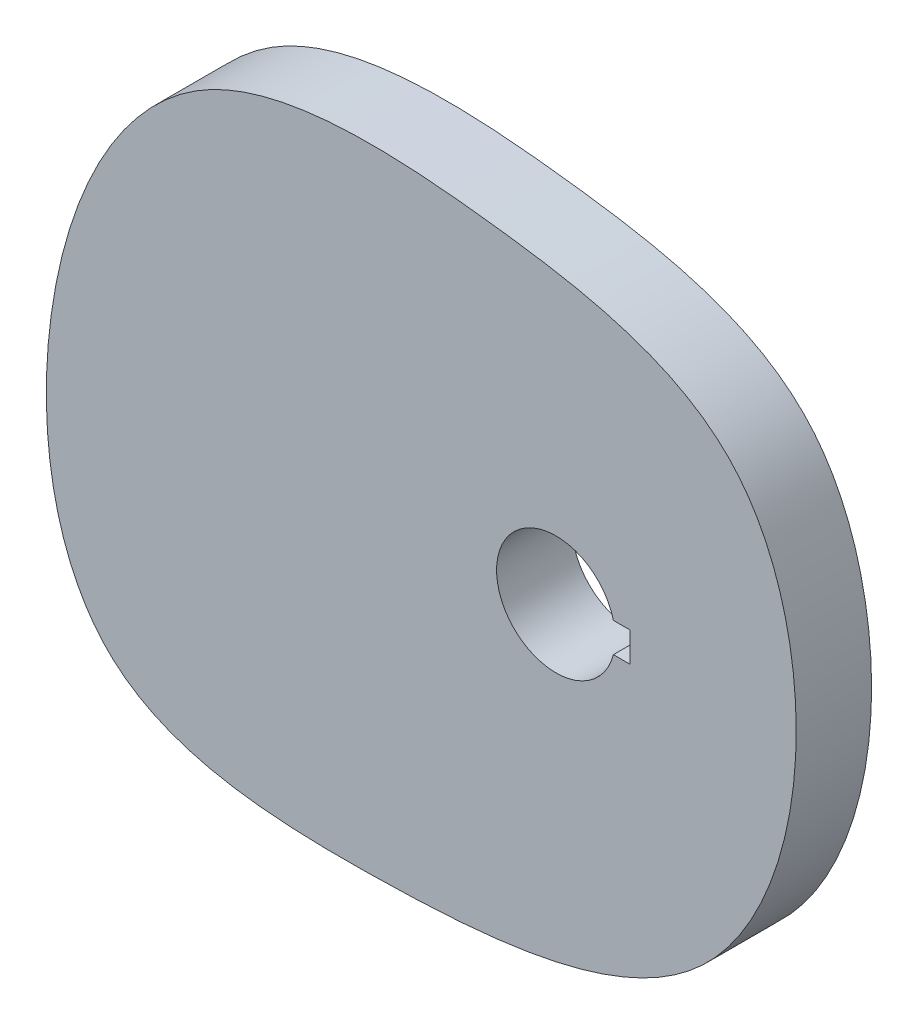
ISO-10303-21;
HEADER;
FILE_DESCRIPTION(('STEP AP214'),'2;1');
FILE_NAME('part.step','',(''),(''),'','','');
FILE_SCHEMA(('AUTOMOTIVE_DESIGN { 1 0 10303 214 1 1 1 1 }'));
ENDSEC;
DATA;
#1=APPLICATION_CONTEXT('core data for automotive mechanical design processes');
#2=APPLICATION_PROTOCOL_DEFINITION('international standard','automotive_design',2000,#1);
#3=PRODUCT_CONTEXT('',#1,'mechanical');
#4=PRODUCT('Part','Part','',(#3));
#5=PRODUCT_RELATED_PRODUCT_CATEGORY('part','',(#4));
#6=PRODUCT_DEFINITION_FORMATION('','',#4);
#7=PRODUCT_DEFINITION_CONTEXT('part definition',#1,'design');
#8=PRODUCT_DEFINITION('design','',#6,#7);
#9=PRODUCT_DEFINITION_SHAPE('','',#8);
#10=(LENGTH_UNIT() NAMED_UNIT(*) SI_UNIT(.MILLI.,.METRE.));
#11=(NAMED_UNIT(*) PLANE_ANGLE_UNIT() SI_UNIT($,.RADIAN.));
#12=(NAMED_UNIT(*) SI_UNIT($,.STERADIAN.) SOLID_ANGLE_UNIT());
#13=UNCERTAINTY_MEASURE_WITH_UNIT(LENGTH_MEASURE(1.E-05),#10,'distance_accuracy_value','');
#14=(GEOMETRIC_REPRESENTATION_CONTEXT(3) GLOBAL_UNCERTAINTY_ASSIGNED_CONTEXT((#13)) GLOBAL_UNIT_ASSIGNED_CONTEXT((#10,
#11,#12)) REPRESENTATION_CONTEXT('',''));
#15=CARTESIAN_POINT('',(0.,0.,0.));
#16=DIRECTION('',(0.,0.,1.));
#17=DIRECTION('',(1.,0.,0.));
#18=AXIS2_PLACEMENT_3D('',#15,#16,#17);
#19=CARTESIAN_POINT('',(-171.443441205203,-33.535808517405,12.7));
#20=DIRECTION('',(0.,0.,-1.));
#21=DIRECTION('',(-1.,0.,0.));
#22=AXIS2_PLACEMENT_3D('',#19,#20,#21);
#23=PLANE('',#22);
#24=CARTESIAN_POINT('',(80.,20.,12.7));
#25=CARTESIAN_POINT('',(77.7152862958963,39.0890435782655,12.7));
#26=CARTESIAN_POINT('',(61.3816559562024,86.2907134094538,12.7));
#27=CARTESIAN_POINT('',(-25.312200484567,103.207072369044,12.7));
#28=CARTESIAN_POINT('',(-130.731631299428,107.805639115145,12.7));
#29=CARTESIAN_POINT('',(-180.04363028462,6.70139491009228,12.7));
#30=CARTESIAN_POINT('',(-165.342731179708,-107.547641326452,12.7));
#31=CARTESIAN_POINT('',(-50.756482262121,-112.60193231846,12.7));
#32=CARTESIAN_POINT('',(62.0064198469547,-101.040992338703,12.7));
#33=CARTESIAN_POINT('',(84.4294115798182,-17.0082389409897,12.7));
#34=CARTESIAN_POINT('',(80.,20.,12.7));
#35=B_SPLINE_CURVE_WITH_KNOTS('',3,(#24,#25,#26,#27,#28,#29,#30,#31,#32,#33,#34),.UNSPECIFIED.,
.T.,.F.,(4,1,1,1,1,1,1,1,4),(0.,0.0722299683513067,0.186828711791828,0.321625365941841,
0.459718268549952,0.583377883104641,0.70703749765933,0.859966586776048,1.),.UNSPECIFIED.);
#36=CARTESIAN_POINT('',(80.,20.,12.7));
#37=VERTEX_POINT('',#36);
#38=EDGE_CURVE('E11',#37,#37,#35,.T.);
#39=ORIENTED_EDGE('',*,*,#38,.T.);
#40=EDGE_LOOP('',(#39));
#41=FACE_BOUND('',#40,.T.);
#42=DIRECTION('',(0.,1.,0.));
#43=VECTOR('',#42,1.);
#44=CARTESIAN_POINT('',(25.,5.,12.7));
#45=LINE('',#44,#43);
#46=CARTESIAN_POINT('',(25.,-5.,12.7));
#47=VERTEX_POINT('',#46);
#48=CARTESIAN_POINT('',(25.,5.,12.7));
#49=VERTEX_POINT('',#48);
#50=EDGE_CURVE('E95',#47,#49,#45,.T.);
#51=ORIENTED_EDGE('',*,*,#50,.F.);
#52=DIRECTION('',(1.,0.,0.));
#53=VECTOR('',#52,1.);
#54=CARTESIAN_POINT('',(19.3649167310371,-5.,12.7));
#55=LINE('',#54,#53);
#56=CARTESIAN_POINT('',(19.3649167310371,-5.,12.7));
#57=VERTEX_POINT('',#56);
#58=EDGE_CURVE('E109',#57,#47,#55,.T.);
#59=ORIENTED_EDGE('',*,*,#58,.F.);
#60=CARTESIAN_POINT('',(0.,0.,12.7));
#61=DIRECTION('',(0.,0.,1.));
#62=DIRECTION('',(1.,0.,0.));
#63=AXIS2_PLACEMENT_3D('',#60,#61,#62);
#64=CIRCLE('',#63,20.);
#65=CARTESIAN_POINT('',(19.3649167310371,5.,12.7));
#66=VERTEX_POINT('',#65);
#67=EDGE_CURVE('E107',#66,#57,#64,.T.);
#68=ORIENTED_EDGE('',*,*,#67,.F.);
#69=DIRECTION('',(-1.,0.,0.));
#70=VECTOR('',#69,1.);
#71=CARTESIAN_POINT('',(19.3649167310371,5.,12.7));
#72=LINE('',#71,#70);
#73=EDGE_CURVE('E105',#49,#66,#72,.T.);
#74=ORIENTED_EDGE('',*,*,#73,.F.);
#75=EDGE_LOOP('',(#51,#59,#68,#74));
#76=FACE_BOUND('',#75,.T.);
#77=ADVANCED_FACE('F36',(#41,#76),#23,.F.);
#78=CARTESIAN_POINT('',(-171.443441205203,-33.535808517405,-12.7));
#79=DIRECTION('',(0.,0.,-1.));
#80=DIRECTION('',(-1.,0.,0.));
#81=AXIS2_PLACEMENT_3D('',#78,#79,#80);
#82=PLANE('',#81);
#83=CARTESIAN_POINT('',(80.,20.,-12.7));
#84=CARTESIAN_POINT('',(77.7152862958963,39.0890435782655,-12.7));
#85=CARTESIAN_POINT('',(61.3816559562024,86.2907134094538,-12.7));
#86=CARTESIAN_POINT('',(-25.312200484567,103.207072369044,-12.7));
#87=CARTESIAN_POINT('',(-130.731631299428,107.805639115145,-12.7));
#88=CARTESIAN_POINT('',(-180.04363028462,6.70139491009228,-12.7));
#89=CARTESIAN_POINT('',(-165.342731179708,-107.547641326452,-12.7));
#90=CARTESIAN_POINT('',(-50.756482262121,-112.60193231846,-12.7));
#91=CARTESIAN_POINT('',(62.0064198469547,-101.040992338703,-12.7));
#92=CARTESIAN_POINT('',(84.4294115798182,-17.0082389409897,-12.7));
#93=CARTESIAN_POINT('',(80.,20.,-12.7));
#94=B_SPLINE_CURVE_WITH_KNOTS('',3,(#83,#84,#85,#86,#87,#88,#89,#90,#91,#92,#93),.UNSPECIFIED.,
.T.,.F.,(4,1,1,1,1,1,1,1,4),(0.,0.0722299683513067,0.186828711791828,0.321625365941841,
0.459718268549952,0.583377883104641,0.70703749765933,0.859966586776048,1.),.UNSPECIFIED.);
#95=CARTESIAN_POINT('',(80.,20.,-12.7));
#96=VERTEX_POINT('',#95);
#97=EDGE_CURVE('E47',#96,#96,#94,.T.);
#98=ORIENTED_EDGE('',*,*,#97,.F.);
#99=EDGE_LOOP('',(#98));
#100=FACE_BOUND('',#99,.T.);
#101=DIRECTION('',(1.,0.,0.));
#102=VECTOR('',#101,1.);
#103=CARTESIAN_POINT('',(19.3649167310371,-5.,-12.7));
#104=LINE('',#103,#102);
#105=CARTESIAN_POINT('',(19.3649167310371,-5.,-12.7));
#106=VERTEX_POINT('',#105);
#107=CARTESIAN_POINT('',(25.,-5.,-12.7));
#108=VERTEX_POINT('',#107);
#109=EDGE_CURVE('E99',#106,#108,#104,.T.);
#110=ORIENTED_EDGE('',*,*,#109,.T.);
#111=DIRECTION('',(0.,1.,0.));
#112=VECTOR('',#111,1.);
#113=CARTESIAN_POINT('',(25.,5.,-12.7));
#114=LINE('',#113,#112);
#115=CARTESIAN_POINT('',(25.,5.,-12.7));
#116=VERTEX_POINT('',#115);
#117=EDGE_CURVE('E62',#108,#116,#114,.T.);
#118=ORIENTED_EDGE('',*,*,#117,.T.);
#119=DIRECTION('',(-1.,0.,0.));
#120=VECTOR('',#119,1.);
#121=CARTESIAN_POINT('',(19.3649167310371,5.,-12.7));
#122=LINE('',#121,#120);
#123=CARTESIAN_POINT('',(19.3649167310371,5.,-12.7));
#124=VERTEX_POINT('',#123);
#125=EDGE_CURVE('E82',#116,#124,#122,.T.);
#126=ORIENTED_EDGE('',*,*,#125,.T.);
#127=CARTESIAN_POINT('',(0.,0.,-12.7));
#128=DIRECTION('',(0.,0.,1.));
#129=DIRECTION('',(1.,0.,0.));
#130=AXIS2_PLACEMENT_3D('',#127,#128,#129);
#131=CIRCLE('',#130,20.);
#132=EDGE_CURVE('E91',#124,#106,#131,.T.);
#133=ORIENTED_EDGE('',*,*,#132,.T.);
#134=EDGE_LOOP('',(#110,#118,#126,#133));
#135=FACE_BOUND('',#134,.T.);
#136=ADVANCED_FACE('F98',(#100,#135),#82,.T.);
#137=DIRECTION('',(0.,0.,-1.));
#138=VECTOR('',#137,1.);
#139=SURFACE_OF_LINEAR_EXTRUSION('',#35,#138);
#140=ORIENTED_EDGE('',*,*,#38,.F.);
#141=EDGE_LOOP('',(#140));
#142=FACE_BOUND('',#141,.T.);
#143=ORIENTED_EDGE('',*,*,#97,.T.);
#144=EDGE_LOOP('',(#143));
#145=FACE_BOUND('',#144,.T.);
#146=ADVANCED_FACE('F38',(#142,#145),#139,.F.);
#147=CARTESIAN_POINT('',(25.,5.,12.7));
#148=DIRECTION('',(-1.,0.,0.));
#149=DIRECTION('',(0.,0.,1.));
#150=AXIS2_PLACEMENT_3D('',#147,#148,#149);
#151=PLANE('',#150);
#152=ORIENTED_EDGE('',*,*,#117,.F.);
#153=DIRECTION('',(0.,0.,-1.));
#154=VECTOR('',#153,1.);
#155=CARTESIAN_POINT('',(25.,-5.,12.7));
#156=LINE('',#155,#154);
#157=EDGE_CURVE('E111',#47,#108,#156,.T.);
#158=ORIENTED_EDGE('',*,*,#157,.F.);
#159=ORIENTED_EDGE('',*,*,#50,.T.);
#160=DIRECTION('',(0.,0.,-1.));
#161=VECTOR('',#160,1.);
#162=CARTESIAN_POINT('',(25.,5.,12.7));
#163=LINE('',#162,#161);
#164=EDGE_CURVE('E84',#49,#116,#163,.T.);
#165=ORIENTED_EDGE('',*,*,#164,.T.);
#166=EDGE_LOOP('',(#152,#158,#159,#165));
#167=FACE_BOUND('',#166,.T.);
#168=ADVANCED_FACE('F93',(#167),#151,.T.);
#169=CARTESIAN_POINT('',(19.3649167310371,5.,12.7));
#170=DIRECTION('',(0.,-1.,0.));
#171=DIRECTION('',(0.,0.,-1.));
#172=AXIS2_PLACEMENT_3D('',#169,#170,#171);
#173=PLANE('',#172);
#174=ORIENTED_EDGE('',*,*,#125,.F.);
#175=ORIENTED_EDGE('',*,*,#164,.F.);
#176=ORIENTED_EDGE('',*,*,#73,.T.);
#177=DIRECTION('',(0.,0.,-1.));
#178=VECTOR('',#177,1.);
#179=CARTESIAN_POINT('',(19.3649167310371,5.,12.7));
#180=LINE('',#179,#178);
#181=EDGE_CURVE('E87',#66,#124,#180,.T.);
#182=ORIENTED_EDGE('',*,*,#181,.T.);
#183=EDGE_LOOP('',(#174,#175,#176,#182));
#184=FACE_BOUND('',#183,.T.);
#185=ADVANCED_FACE('F83',(#184),#173,.T.);
#186=CARTESIAN_POINT('',(0.,0.,12.7));
#187=DIRECTION('',(0.,0.,-1.));
#188=DIRECTION('',(-1.,0.,0.));
#189=AXIS2_PLACEMENT_3D('',#186,#187,#188);
#190=CYLINDRICAL_SURFACE('',#189,20.);
#191=ORIENTED_EDGE('',*,*,#132,.F.);
#192=ORIENTED_EDGE('',*,*,#181,.F.);
#193=ORIENTED_EDGE('',*,*,#67,.T.);
#194=DIRECTION('',(0.,0.,-1.));
#195=VECTOR('',#194,1.);
#196=CARTESIAN_POINT('',(19.3649167310371,-5.,12.7));
#197=LINE('',#196,#195);
#198=EDGE_CURVE('E54',#57,#106,#197,.T.);
#199=ORIENTED_EDGE('',*,*,#198,.T.);
#200=EDGE_LOOP('',(#191,#192,#193,#199));
#201=FACE_BOUND('',#200,.T.);
#202=ADVANCED_FACE('F136',(#201),#190,.F.);
#203=CARTESIAN_POINT('',(19.3649167310371,-5.,12.7));
#204=DIRECTION('',(0.,1.,0.));
#205=DIRECTION('',(0.,0.,1.));
#206=AXIS2_PLACEMENT_3D('',#203,#204,#205);
#207=PLANE('',#206);
#208=ORIENTED_EDGE('',*,*,#109,.F.);
#209=ORIENTED_EDGE('',*,*,#198,.F.);
#210=ORIENTED_EDGE('',*,*,#58,.T.);
#211=ORIENTED_EDGE('',*,*,#157,.T.);
#212=EDGE_LOOP('',(#208,#209,#210,#211));
#213=FACE_BOUND('',#212,.T.);
#214=ADVANCED_FACE('F139',(#213),#207,.T.);
#215=CLOSED_SHELL('',(#77,#136,#146,#168,#185,#202,#214));
#216=MANIFOLD_SOLID_BREP('B2',#215);
#217=ADVANCED_BREP_SHAPE_REPRESENTATION('',(#18,#216),#14);
#218=SHAPE_DEFINITION_REPRESENTATION(#9,#217);
ENDSEC;
END-ISO-10303-21;
